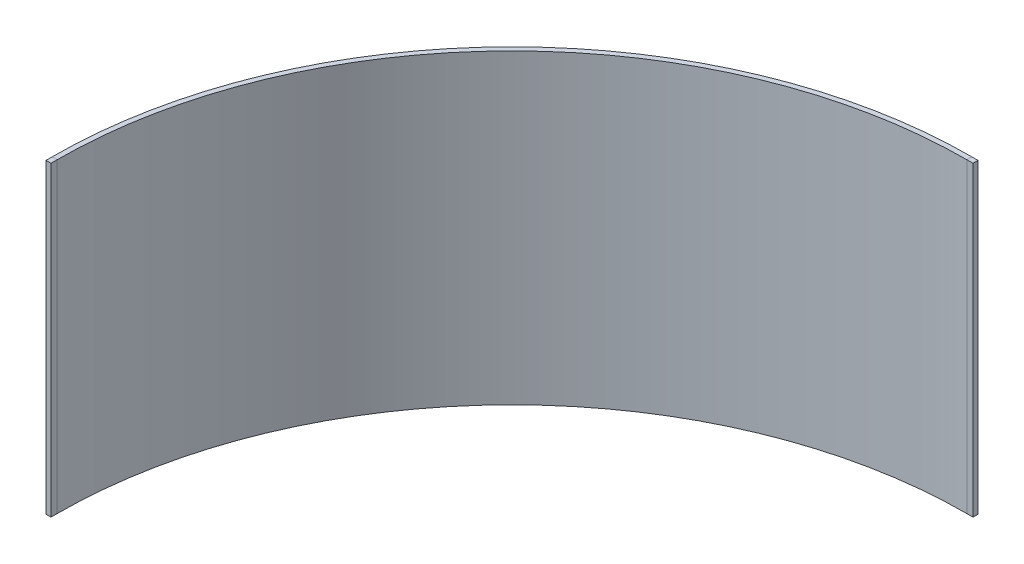
ISO-10303-21;
HEADER;
FILE_DESCRIPTION(('STEP AP214'),'2;1');
FILE_NAME('part.step','',(''),(''),'','','');
FILE_SCHEMA(('AUTOMOTIVE_DESIGN { 1 0 10303 214 1 1 1 1 }'));
ENDSEC;
DATA;
#1=APPLICATION_CONTEXT('core data for automotive mechanical design processes');
#2=APPLICATION_PROTOCOL_DEFINITION('international standard','automotive_design',2000,#1);
#3=PRODUCT_CONTEXT('',#1,'mechanical');
#4=PRODUCT('Part','Part','',(#3));
#5=PRODUCT_RELATED_PRODUCT_CATEGORY('part','',(#4));
#6=PRODUCT_DEFINITION_FORMATION('','',#4);
#7=PRODUCT_DEFINITION_CONTEXT('part definition',#1,'design');
#8=PRODUCT_DEFINITION('design','',#6,#7);
#9=PRODUCT_DEFINITION_SHAPE('','',#8);
#10=(LENGTH_UNIT() NAMED_UNIT(*) SI_UNIT(.MILLI.,.METRE.));
#11=(NAMED_UNIT(*) PLANE_ANGLE_UNIT() SI_UNIT($,.RADIAN.));
#12=(NAMED_UNIT(*) SI_UNIT($,.STERADIAN.) SOLID_ANGLE_UNIT());
#13=UNCERTAINTY_MEASURE_WITH_UNIT(LENGTH_MEASURE(1.E-05),#10,'distance_accuracy_value','');
#14=(GEOMETRIC_REPRESENTATION_CONTEXT(3) GLOBAL_UNCERTAINTY_ASSIGNED_CONTEXT((#13)) GLOBAL_UNIT_ASSIGNED_CONTEXT((#10,
#11,#12)) REPRESENTATION_CONTEXT('',''));
#15=CARTESIAN_POINT('',(0.,0.,0.));
#16=DIRECTION('',(0.,0.,1.));
#17=DIRECTION('',(1.,0.,0.));
#18=AXIS2_PLACEMENT_3D('',#15,#16,#17);
#19=CARTESIAN_POINT('',(-53.3802564486915,49.2,15.4157428018243));
#20=DIRECTION('',(0.,1.,0.));
#21=DIRECTION('',(0.,0.,1.));
#22=AXIS2_PLACEMENT_3D('',#19,#20,#21);
#23=PLANE('',#22);
#24=DIRECTION('',(-1.,0.,0.));
#25=VECTOR('',#24,1.);
#26=CARTESIAN_POINT('',(-53.3802564486915,49.2,15.4157428018243));
#27=LINE('',#26,#25);
#28=CARTESIAN_POINT('',(-53.3802564486915,49.2,15.4157428018243));
#29=VERTEX_POINT('',#28);
#30=CARTESIAN_POINT('',(-54.1802564486915,49.2,15.4157428018243));
#31=VERTEX_POINT('',#30);
#32=EDGE_CURVE('E11',#29,#31,#27,.T.);
#33=ORIENTED_EDGE('',*,*,#32,.F.);
#34=CARTESIAN_POINT('',(19.6197435513085,49.2,15.4157428018238));
#35=DIRECTION('',(0.,1.,0.));
#36=DIRECTION('',(0.,0.,-1.));
#37=AXIS2_PLACEMENT_3D('',#34,#35,#36);
#38=CIRCLE('',#37,73.);
#39=CARTESIAN_POINT('',(19.619743551309,49.2,-57.5842571981762));
#40=VERTEX_POINT('',#39);
#41=EDGE_CURVE('E130',#40,#29,#38,.T.);
#42=ORIENTED_EDGE('',*,*,#41,.F.);
#43=DIRECTION('',(0.,0.,1.));
#44=VECTOR('',#43,1.);
#45=CARTESIAN_POINT('',(19.619743551309,49.2,-58.3842571981762));
#46=LINE('',#45,#44);
#47=CARTESIAN_POINT('',(19.619743551309,49.2,-58.3842571981762));
#48=VERTEX_POINT('',#47);
#49=EDGE_CURVE('E41',#48,#40,#46,.T.);
#50=ORIENTED_EDGE('',*,*,#49,.F.);
#51=CARTESIAN_POINT('',(19.6197435513085,49.2,15.4157428018238));
#52=DIRECTION('',(0.,1.,0.));
#53=DIRECTION('',(1.,0.,0.));
#54=AXIS2_PLACEMENT_3D('',#51,#52,#53);
#55=CIRCLE('',#54,73.8);
#56=EDGE_CURVE('E123',#48,#31,#55,.T.);
#57=ORIENTED_EDGE('',*,*,#56,.T.);
#58=EDGE_LOOP('',(#33,#42,#50,#57));
#59=FACE_BOUND('',#58,.T.);
#60=ADVANCED_FACE('F33',(#59),#23,.T.);
#61=CARTESIAN_POINT('',(19.619743551309,49.2,-58.3842571981762));
#62=DIRECTION('',(0.,1.,0.));
#63=DIRECTION('',(0.,0.,1.));
#64=AXIS2_PLACEMENT_3D('',#61,#62,#63);
#65=PLANE('',#64);
#66=DIRECTION('',(0.,0.,1.));
#67=VECTOR('',#66,1.);
#68=CARTESIAN_POINT('',(-53.3802564486915,49.2,15.4157428018243));
#69=LINE('',#68,#67);
#70=CARTESIAN_POINT('',(-53.3802564486915,49.2,16.4157428018243));
#71=VERTEX_POINT('',#70);
#72=EDGE_CURVE('E179',#29,#71,#69,.T.);
#73=ORIENTED_EDGE('',*,*,#72,.F.);
#74=ORIENTED_EDGE('',*,*,#32,.T.);
#75=DIRECTION('',(0.,0.,-1.));
#76=VECTOR('',#75,1.);
#77=CARTESIAN_POINT('',(-54.1802564486915,49.2,15.4157428018243));
#78=LINE('',#77,#76);
#79=CARTESIAN_POINT('',(-54.1802564486915,49.2,16.4157428018243));
#80=VERTEX_POINT('',#79);
#81=EDGE_CURVE('E89',#31,#80,#78,.F.);
#82=ORIENTED_EDGE('',*,*,#81,.T.);
#83=DIRECTION('',(-1.,0.,0.));
#84=VECTOR('',#83,1.);
#85=CARTESIAN_POINT('',(-53.3802564486915,49.2,16.4157428018243));
#86=LINE('',#85,#84);
#87=EDGE_CURVE('E336',#71,#80,#86,.T.);
#88=ORIENTED_EDGE('',*,*,#87,.F.);
#89=EDGE_LOOP('',(#73,#74,#82,#88));
#90=FACE_BOUND('',#89,.T.);
#91=ADVANCED_FACE('F187',(#90),#65,.T.);
#92=CARTESIAN_POINT('',(19.619743551309,0.,-57.5842571981762));
#93=DIRECTION('',(0.,-1.,0.));
#94=DIRECTION('',(0.,0.,-1.));
#95=AXIS2_PLACEMENT_3D('',#92,#93,#94);
#96=PLANE('',#95);
#97=DIRECTION('',(0.,0.,-1.));
#98=VECTOR('',#97,1.);
#99=CARTESIAN_POINT('',(19.619743551309,0.,-57.5842571981762));
#100=LINE('',#99,#98);
#101=CARTESIAN_POINT('',(19.619743551309,0.,-57.5842571981762));
#102=VERTEX_POINT('',#101);
#103=CARTESIAN_POINT('',(19.619743551309,0.,-58.3842571981762));
#104=VERTEX_POINT('',#103);
#105=EDGE_CURVE('E76',#102,#104,#100,.T.);
#106=ORIENTED_EDGE('',*,*,#105,.F.);
#107=CARTESIAN_POINT('',(19.6197435513085,0.,15.4157428018238));
#108=DIRECTION('',(0.,1.,0.));
#109=DIRECTION('',(0.,0.,-1.));
#110=AXIS2_PLACEMENT_3D('',#107,#108,#109);
#111=CIRCLE('',#110,73.);
#112=CARTESIAN_POINT('',(-53.3802564486915,0.,15.4157428018243));
#113=VERTEX_POINT('',#112);
#114=EDGE_CURVE('E145',#102,#113,#111,.T.);
#115=ORIENTED_EDGE('',*,*,#114,.T.);
#116=DIRECTION('',(1.,0.,0.));
#117=VECTOR('',#116,1.);
#118=CARTESIAN_POINT('',(-54.1802564486915,0.,15.4157428018243));
#119=LINE('',#118,#117);
#120=CARTESIAN_POINT('',(-54.1802564486915,0.,15.4157428018243));
#121=VERTEX_POINT('',#120);
#122=EDGE_CURVE('E83',#121,#113,#119,.T.);
#123=ORIENTED_EDGE('',*,*,#122,.F.);
#124=CARTESIAN_POINT('',(19.6197435513085,0.,15.4157428018238));
#125=DIRECTION('',(0.,1.,0.));
#126=DIRECTION('',(1.,0.,0.));
#127=AXIS2_PLACEMENT_3D('',#124,#125,#126);
#128=CIRCLE('',#127,73.8);
#129=EDGE_CURVE('E152',#104,#121,#128,.T.);
#130=ORIENTED_EDGE('',*,*,#129,.F.);
#131=EDGE_LOOP('',(#106,#115,#123,#130));
#132=FACE_BOUND('',#131,.T.);
#133=ADVANCED_FACE('F185',(#132),#96,.T.);
#134=CARTESIAN_POINT('',(-54.1802564486915,0.,15.4157428018243));
#135=DIRECTION('',(0.,-1.,0.));
#136=DIRECTION('',(0.,0.,-1.));
#137=AXIS2_PLACEMENT_3D('',#134,#135,#136);
#138=PLANE('',#137);
#139=DIRECTION('',(-1.,0.,0.));
#140=VECTOR('',#139,1.);
#141=CARTESIAN_POINT('',(19.619743551309,0.,-57.5842571981762));
#142=LINE('',#141,#140);
#143=CARTESIAN_POINT('',(20.619743551309,0.,-57.5842571981762));
#144=VERTEX_POINT('',#143);
#145=EDGE_CURVE('E147',#144,#102,#142,.T.);
#146=ORIENTED_EDGE('',*,*,#145,.T.);
#147=ORIENTED_EDGE('',*,*,#105,.T.);
#148=DIRECTION('',(1.,0.,0.));
#149=VECTOR('',#148,1.);
#150=CARTESIAN_POINT('',(19.619743551309,0.,-58.3842571981762));
#151=LINE('',#150,#149);
#152=CARTESIAN_POINT('',(20.619743551309,0.,-58.3842571981762));
#153=VERTEX_POINT('',#152);
#154=EDGE_CURVE('E150',#153,#104,#151,.F.);
#155=ORIENTED_EDGE('',*,*,#154,.F.);
#156=DIRECTION('',(0.,0.,1.));
#157=VECTOR('',#156,1.);
#158=CARTESIAN_POINT('',(20.619743551309,0.,-58.3842571981762));
#159=LINE('',#158,#157);
#160=EDGE_CURVE('E111',#153,#144,#159,.T.);
#161=ORIENTED_EDGE('',*,*,#160,.T.);
#162=EDGE_LOOP('',(#146,#147,#155,#161));
#163=FACE_BOUND('',#162,.T.);
#164=ADVANCED_FACE('F181',(#163),#138,.T.);
#165=CARTESIAN_POINT('',(-54.1802564486915,49.2,15.4157428018243));
#166=DIRECTION('',(1.,0.,0.));
#167=DIRECTION('',(0.,0.,-1.));
#168=AXIS2_PLACEMENT_3D('',#165,#166,#167);
#169=PLANE('',#168);
#170=DIRECTION('',(0.,0.,-1.));
#171=VECTOR('',#170,1.);
#172=CARTESIAN_POINT('',(-54.1802564486915,0.,15.4157428018243));
#173=LINE('',#172,#171);
#174=CARTESIAN_POINT('',(-54.1802564486915,0.,16.4157428018243));
#175=VERTEX_POINT('',#174);
#176=EDGE_CURVE('E136',#121,#175,#173,.F.);
#177=ORIENTED_EDGE('',*,*,#176,.T.);
#178=DIRECTION('',(0.,-1.,0.));
#179=VECTOR('',#178,1.);
#180=CARTESIAN_POINT('',(-54.1802564486915,49.2,16.4157428018243));
#181=LINE('',#180,#179);
#182=EDGE_CURVE('E166',#80,#175,#181,.T.);
#183=ORIENTED_EDGE('',*,*,#182,.F.);
#184=ORIENTED_EDGE('',*,*,#81,.F.);
#185=DIRECTION('',(0.,-1.,0.));
#186=VECTOR('',#185,1.);
#187=CARTESIAN_POINT('',(-54.1802564486915,49.2,15.4157428018243));
#188=LINE('',#187,#186);
#189=EDGE_CURVE('E135',#31,#121,#188,.T.);
#190=ORIENTED_EDGE('',*,*,#189,.T.);
#191=EDGE_LOOP('',(#177,#183,#184,#190));
#192=FACE_BOUND('',#191,.T.);
#193=ADVANCED_FACE('F193',(#192),#169,.F.);
#194=CARTESIAN_POINT('',(-53.3802564486915,49.2,16.4157428018243));
#195=DIRECTION('',(0.,0.,1.));
#196=DIRECTION('',(1.,0.,0.));
#197=AXIS2_PLACEMENT_3D('',#194,#195,#196);
#198=PLANE('',#197);
#199=DIRECTION('',(-1.,0.,0.));
#200=VECTOR('',#199,1.);
#201=CARTESIAN_POINT('',(-53.3802564486915,0.,16.4157428018243));
#202=LINE('',#201,#200);
#203=CARTESIAN_POINT('',(-53.3802564486915,0.,16.4157428018243));
#204=VERTEX_POINT('',#203);
#205=EDGE_CURVE('E139',#204,#175,#202,.T.);
#206=ORIENTED_EDGE('',*,*,#205,.F.);
#207=DIRECTION('',(0.,-1.,0.));
#208=VECTOR('',#207,1.);
#209=CARTESIAN_POINT('',(-53.3802564486915,49.2,16.4157428018243));
#210=LINE('',#209,#208);
#211=EDGE_CURVE('E164',#71,#204,#210,.T.);
#212=ORIENTED_EDGE('',*,*,#211,.F.);
#213=ORIENTED_EDGE('',*,*,#87,.T.);
#214=ORIENTED_EDGE('',*,*,#182,.T.);
#215=EDGE_LOOP('',(#206,#212,#213,#214));
#216=FACE_BOUND('',#215,.T.);
#217=ADVANCED_FACE('F224',(#216),#198,.T.);
#218=CARTESIAN_POINT('',(-53.3802564486915,49.2,15.4157428018243));
#219=DIRECTION('',(1.,0.,0.));
#220=DIRECTION('',(0.,0.,-1.));
#221=AXIS2_PLACEMENT_3D('',#218,#219,#220);
#222=PLANE('',#221);
#223=DIRECTION('',(0.,0.,1.));
#224=VECTOR('',#223,1.);
#225=CARTESIAN_POINT('',(-53.3802564486915,0.,15.4157428018243));
#226=LINE('',#225,#224);
#227=EDGE_CURVE('E142',#113,#204,#226,.T.);
#228=ORIENTED_EDGE('',*,*,#227,.F.);
#229=DIRECTION('',(0.,-1.,0.));
#230=VECTOR('',#229,1.);
#231=CARTESIAN_POINT('',(-53.3802564486915,49.2,15.4157428018243));
#232=LINE('',#231,#230);
#233=EDGE_CURVE('E161',#29,#113,#232,.T.);
#234=ORIENTED_EDGE('',*,*,#233,.F.);
#235=ORIENTED_EDGE('',*,*,#72,.T.);
#236=ORIENTED_EDGE('',*,*,#211,.T.);
#237=EDGE_LOOP('',(#228,#234,#235,#236));
#238=FACE_BOUND('',#237,.T.);
#239=ADVANCED_FACE('F235',(#238),#222,.T.);
#240=CARTESIAN_POINT('',(19.6197435513085,49.2,15.4157428018238));
#241=DIRECTION('',(0.,-1.,0.));
#242=DIRECTION('',(0.,0.,-1.));
#243=AXIS2_PLACEMENT_3D('',#240,#241,#242);
#244=CYLINDRICAL_SURFACE('',#243,73.);
#245=ORIENTED_EDGE('',*,*,#114,.F.);
#246=DIRECTION('',(0.,-1.,0.));
#247=VECTOR('',#246,1.);
#248=CARTESIAN_POINT('',(19.619743551309,49.2,-57.5842571981762));
#249=LINE('',#248,#247);
#250=EDGE_CURVE('E158',#40,#102,#249,.T.);
#251=ORIENTED_EDGE('',*,*,#250,.F.);
#252=ORIENTED_EDGE('',*,*,#41,.T.);
#253=ORIENTED_EDGE('',*,*,#233,.T.);
#254=EDGE_LOOP('',(#245,#251,#252,#253));
#255=FACE_BOUND('',#254,.T.);
#256=ADVANCED_FACE('F175',(#255),#244,.F.);
#257=CARTESIAN_POINT('',(19.619743551309,49.2,-57.5842571981762));
#258=DIRECTION('',(0.,0.,1.));
#259=DIRECTION('',(1.,0.,0.));
#260=AXIS2_PLACEMENT_3D('',#257,#258,#259);
#261=PLANE('',#260);
#262=ORIENTED_EDGE('',*,*,#145,.F.);
#263=DIRECTION('',(0.,-1.,0.));
#264=VECTOR('',#263,1.);
#265=CARTESIAN_POINT('',(20.619743551309,49.2,-57.5842571981762));
#266=LINE('',#265,#264);
#267=CARTESIAN_POINT('',(20.619743551309,49.2,-57.5842571981762));
#268=VERTEX_POINT('',#267);
#269=EDGE_CURVE('E113',#268,#144,#266,.T.);
#270=ORIENTED_EDGE('',*,*,#269,.F.);
#271=DIRECTION('',(-1.,0.,0.));
#272=VECTOR('',#271,1.);
#273=CARTESIAN_POINT('',(19.619743551309,49.2,-57.5842571981762));
#274=LINE('',#273,#272);
#275=EDGE_CURVE('E128',#268,#40,#274,.T.);
#276=ORIENTED_EDGE('',*,*,#275,.T.);
#277=ORIENTED_EDGE('',*,*,#250,.T.);
#278=EDGE_LOOP('',(#262,#270,#276,#277));
#279=FACE_BOUND('',#278,.T.);
#280=ADVANCED_FACE('F180',(#279),#261,.T.);
#281=CARTESIAN_POINT('',(20.619743551309,49.2,-58.3842571981762));
#282=DIRECTION('',(1.,0.,0.));
#283=DIRECTION('',(0.,0.,-1.));
#284=AXIS2_PLACEMENT_3D('',#281,#282,#283);
#285=PLANE('',#284);
#286=ORIENTED_EDGE('',*,*,#160,.F.);
#287=DIRECTION('',(0.,-1.,0.));
#288=VECTOR('',#287,1.);
#289=CARTESIAN_POINT('',(20.619743551309,49.2,-58.3842571981762));
#290=LINE('',#289,#288);
#291=CARTESIAN_POINT('',(20.619743551309,49.2,-58.3842571981762));
#292=VERTEX_POINT('',#291);
#293=EDGE_CURVE('E105',#292,#153,#290,.T.);
#294=ORIENTED_EDGE('',*,*,#293,.F.);
#295=DIRECTION('',(0.,0.,1.));
#296=VECTOR('',#295,1.);
#297=CARTESIAN_POINT('',(20.619743551309,49.2,-58.3842571981762));
#298=LINE('',#297,#296);
#299=EDGE_CURVE('E109',#292,#268,#298,.T.);
#300=ORIENTED_EDGE('',*,*,#299,.T.);
#301=ORIENTED_EDGE('',*,*,#269,.T.);
#302=EDGE_LOOP('',(#286,#294,#300,#301));
#303=FACE_BOUND('',#302,.T.);
#304=ADVANCED_FACE('F107',(#303),#285,.T.);
#305=CARTESIAN_POINT('',(19.619743551309,49.2,-58.3842571981762));
#306=DIRECTION('',(0.,0.,1.));
#307=DIRECTION('',(1.,0.,0.));
#308=AXIS2_PLACEMENT_3D('',#305,#306,#307);
#309=PLANE('',#308);
#310=ORIENTED_EDGE('',*,*,#154,.T.);
#311=DIRECTION('',(0.,-1.,0.));
#312=VECTOR('',#311,1.);
#313=CARTESIAN_POINT('',(19.619743551309,49.2,-58.3842571981762));
#314=LINE('',#313,#312);
#315=EDGE_CURVE('E114',#48,#104,#314,.T.);
#316=ORIENTED_EDGE('',*,*,#315,.F.);
#317=DIRECTION('',(1.,0.,0.));
#318=VECTOR('',#317,1.);
#319=CARTESIAN_POINT('',(19.619743551309,49.2,-58.3842571981762));
#320=LINE('',#319,#318);
#321=EDGE_CURVE('E118',#292,#48,#320,.F.);
#322=ORIENTED_EDGE('',*,*,#321,.F.);
#323=ORIENTED_EDGE('',*,*,#293,.T.);
#324=EDGE_LOOP('',(#310,#316,#322,#323));
#325=FACE_BOUND('',#324,.T.);
#326=ADVANCED_FACE('F119',(#325),#309,.F.);
#327=CARTESIAN_POINT('',(19.6197435513085,49.2,15.4157428018238));
#328=DIRECTION('',(0.,-1.,0.));
#329=DIRECTION('',(0.,0.,-1.));
#330=AXIS2_PLACEMENT_3D('',#327,#328,#329);
#331=CYLINDRICAL_SURFACE('',#330,73.8);
#332=ORIENTED_EDGE('',*,*,#129,.T.);
#333=ORIENTED_EDGE('',*,*,#189,.F.);
#334=ORIENTED_EDGE('',*,*,#56,.F.);
#335=ORIENTED_EDGE('',*,*,#315,.T.);
#336=EDGE_LOOP('',(#332,#333,#334,#335));
#337=FACE_BOUND('',#336,.T.);
#338=ADVANCED_FACE('F183',(#337),#331,.T.);
#339=CARTESIAN_POINT('',(19.6197435513085,49.2,15.4157428018238));
#340=DIRECTION('',(0.,1.,0.));
#341=DIRECTION('',(0.,0.,1.));
#342=AXIS2_PLACEMENT_3D('',#339,#340,#341);
#343=PLANE('',#342);
#344=ORIENTED_EDGE('',*,*,#321,.T.);
#345=ORIENTED_EDGE('',*,*,#49,.T.);
#346=ORIENTED_EDGE('',*,*,#275,.F.);
#347=ORIENTED_EDGE('',*,*,#299,.F.);
#348=EDGE_LOOP('',(#344,#345,#346,#347));
#349=FACE_BOUND('',#348,.T.);
#350=ADVANCED_FACE('F126',(#349),#343,.T.);
#351=CARTESIAN_POINT('',(19.6197435513085,0.,15.4157428018238));
#352=DIRECTION('',(0.,1.,0.));
#353=DIRECTION('',(0.,0.,1.));
#354=AXIS2_PLACEMENT_3D('',#351,#352,#353);
#355=PLANE('',#354);
#356=ORIENTED_EDGE('',*,*,#176,.F.);
#357=ORIENTED_EDGE('',*,*,#122,.T.);
#358=ORIENTED_EDGE('',*,*,#227,.T.);
#359=ORIENTED_EDGE('',*,*,#205,.T.);
#360=EDGE_LOOP('',(#356,#357,#358,#359));
#361=FACE_BOUND('',#360,.T.);
#362=ADVANCED_FACE('F301',(#361),#355,.F.);
#363=CLOSED_SHELL('',(#60,#91,#133,#164,#193,#217,#239,#256,#280,#304,#326,#338,#350,#362));
#364=MANIFOLD_SOLID_BREP('B2',#363);
#365=ADVANCED_BREP_SHAPE_REPRESENTATION('',(#18,#364),#14);
#366=SHAPE_DEFINITION_REPRESENTATION(#9,#365);
ENDSEC;
END-ISO-10303-21;
